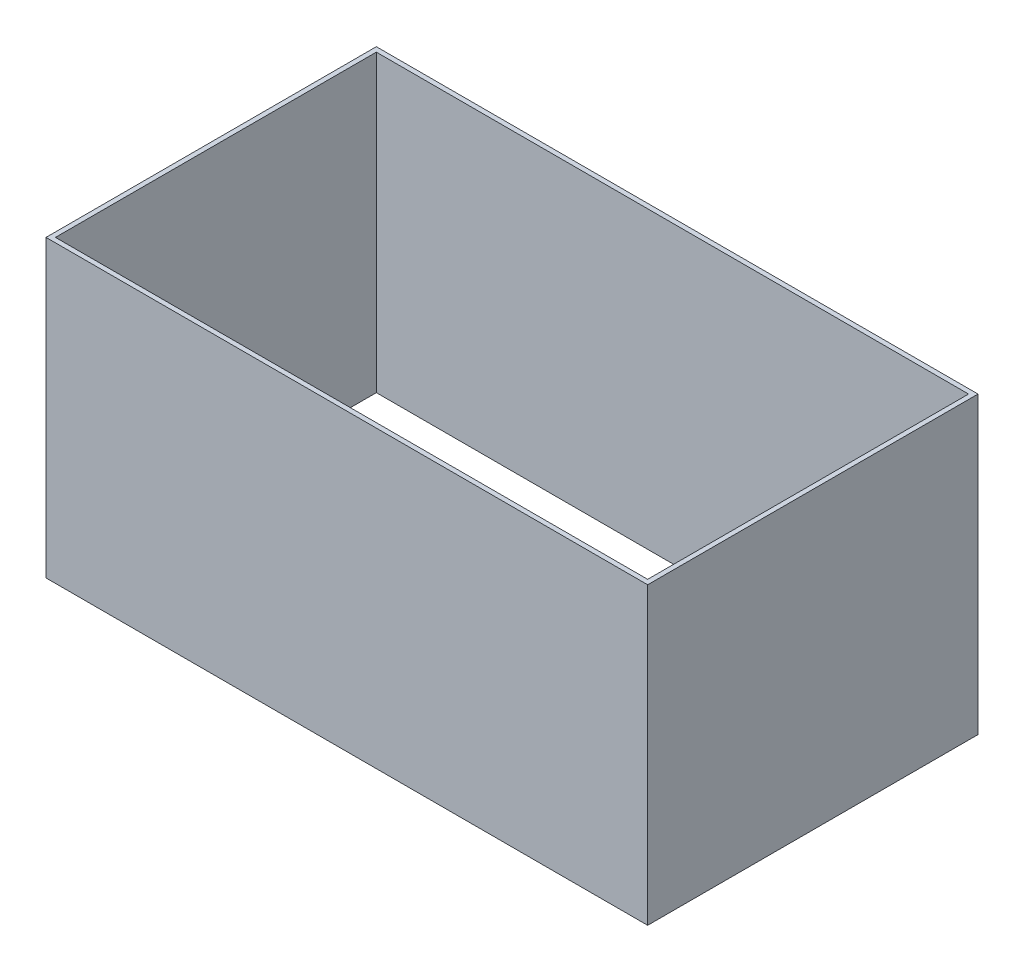
ISO-10303-21;
HEADER;
FILE_DESCRIPTION(('STEP AP214'),'2;1');
FILE_NAME('part.step','',(''),(''),'','','');
FILE_SCHEMA(('AUTOMOTIVE_DESIGN { 1 0 10303 214 1 1 1 1 }'));
ENDSEC;
DATA;
#1=APPLICATION_CONTEXT('core data for automotive mechanical design processes');
#2=APPLICATION_PROTOCOL_DEFINITION('international standard','automotive_design',2000,#1);
#3=PRODUCT_CONTEXT('',#1,'mechanical');
#4=PRODUCT('Part','Part','',(#3));
#5=PRODUCT_RELATED_PRODUCT_CATEGORY('part','',(#4));
#6=PRODUCT_DEFINITION_FORMATION('','',#4);
#7=PRODUCT_DEFINITION_CONTEXT('part definition',#1,'design');
#8=PRODUCT_DEFINITION('design','',#6,#7);
#9=PRODUCT_DEFINITION_SHAPE('','',#8);
#10=(LENGTH_UNIT() NAMED_UNIT(*) SI_UNIT(.MILLI.,.METRE.));
#11=(NAMED_UNIT(*) PLANE_ANGLE_UNIT() SI_UNIT($,.RADIAN.));
#12=(NAMED_UNIT(*) SI_UNIT($,.STERADIAN.) SOLID_ANGLE_UNIT());
#13=UNCERTAINTY_MEASURE_WITH_UNIT(LENGTH_MEASURE(1.E-05),#10,'distance_accuracy_value','');
#14=(GEOMETRIC_REPRESENTATION_CONTEXT(3) GLOBAL_UNCERTAINTY_ASSIGNED_CONTEXT((#13)) GLOBAL_UNIT_ASSIGNED_CONTEXT((#10,
#11,#12)) REPRESENTATION_CONTEXT('',''));
#15=CARTESIAN_POINT('',(0.,0.,0.));
#16=DIRECTION('',(0.,0.,1.));
#17=DIRECTION('',(1.,0.,0.));
#18=AXIS2_PLACEMENT_3D('',#15,#16,#17);
#19=CARTESIAN_POINT('',(0.,50.,0.));
#20=DIRECTION('',(0.,1.,0.));
#21=DIRECTION('',(0.,0.,1.));
#22=AXIS2_PLACEMENT_3D('',#19,#20,#21);
#23=PLANE('',#22);
#24=DIRECTION('',(0.,0.,-1.));
#25=VECTOR('',#24,1.);
#26=CARTESIAN_POINT('',(51.,50.,-28.));
#27=LINE('',#26,#25);
#28=CARTESIAN_POINT('',(51.,50.,28.));
#29=VERTEX_POINT('',#28);
#30=CARTESIAN_POINT('',(51.,50.,-28.));
#31=VERTEX_POINT('',#30);
#32=EDGE_CURVE('E187',#29,#31,#27,.T.);
#33=ORIENTED_EDGE('',*,*,#32,.T.);
#34=DIRECTION('',(-1.,0.,0.));
#35=VECTOR('',#34,1.);
#36=CARTESIAN_POINT('',(-51.,50.,-28.));
#37=LINE('',#36,#35);
#38=CARTESIAN_POINT('',(-51.,50.,-28.));
#39=VERTEX_POINT('',#38);
#40=EDGE_CURVE('E190',#31,#39,#37,.T.);
#41=ORIENTED_EDGE('',*,*,#40,.T.);
#42=DIRECTION('',(0.,0.,1.));
#43=VECTOR('',#42,1.);
#44=CARTESIAN_POINT('',(-51.,50.,-28.));
#45=LINE('',#44,#43);
#46=CARTESIAN_POINT('',(-51.,50.,28.));
#47=VERTEX_POINT('',#46);
#48=EDGE_CURVE('E193',#39,#47,#45,.T.);
#49=ORIENTED_EDGE('',*,*,#48,.T.);
#50=DIRECTION('',(1.,0.,0.));
#51=VECTOR('',#50,1.);
#52=CARTESIAN_POINT('',(-51.,50.,28.));
#53=LINE('',#52,#51);
#54=EDGE_CURVE('E195',#47,#29,#53,.T.);
#55=ORIENTED_EDGE('',*,*,#54,.T.);
#56=EDGE_LOOP('',(#33,#41,#49,#55));
#57=FACE_BOUND('',#56,.T.);
#58=DIRECTION('',(-1.,0.,0.));
#59=VECTOR('',#58,1.);
#60=CARTESIAN_POINT('',(-50.2,50.,-27.2));
#61=LINE('',#60,#59);
#62=CARTESIAN_POINT('',(50.2,50.,-27.2));
#63=VERTEX_POINT('',#62);
#64=CARTESIAN_POINT('',(-50.2,50.,-27.2));
#65=VERTEX_POINT('',#64);
#66=EDGE_CURVE('E160',#63,#65,#61,.T.);
#67=ORIENTED_EDGE('',*,*,#66,.F.);
#68=DIRECTION('',(0.,0.,-1.));
#69=VECTOR('',#68,1.);
#70=CARTESIAN_POINT('',(50.2,50.,27.2));
#71=LINE('',#70,#69);
#72=CARTESIAN_POINT('',(50.2,50.,27.2));
#73=VERTEX_POINT('',#72);
#74=EDGE_CURVE('E158',#73,#63,#71,.T.);
#75=ORIENTED_EDGE('',*,*,#74,.F.);
#76=DIRECTION('',(1.,0.,0.));
#77=VECTOR('',#76,1.);
#78=CARTESIAN_POINT('',(-50.2,50.,27.2));
#79=LINE('',#78,#77);
#80=CARTESIAN_POINT('',(-50.2,50.,27.2));
#81=VERTEX_POINT('',#80);
#82=EDGE_CURVE('E165',#81,#73,#79,.T.);
#83=ORIENTED_EDGE('',*,*,#82,.F.);
#84=DIRECTION('',(0.,0.,1.));
#85=VECTOR('',#84,1.);
#86=CARTESIAN_POINT('',(-50.2,50.,27.2));
#87=LINE('',#86,#85);
#88=EDGE_CURVE('E163',#65,#81,#87,.T.);
#89=ORIENTED_EDGE('',*,*,#88,.F.);
#90=EDGE_LOOP('',(#67,#75,#83,#89));
#91=FACE_BOUND('',#90,.T.);
#92=ADVANCED_FACE('F33',(#57,#91),#23,.T.);
#93=CARTESIAN_POINT('',(0.,0.,0.));
#94=DIRECTION('',(0.,1.,0.));
#95=DIRECTION('',(0.,0.,1.));
#96=AXIS2_PLACEMENT_3D('',#93,#94,#95);
#97=PLANE('',#96);
#98=DIRECTION('',(0.,0.,1.));
#99=VECTOR('',#98,1.);
#100=CARTESIAN_POINT('',(-51.,0.,-28.));
#101=LINE('',#100,#99);
#102=CARTESIAN_POINT('',(-51.,0.,-7.));
#103=VERTEX_POINT('',#102);
#104=CARTESIAN_POINT('',(-51.,0.,28.));
#105=VERTEX_POINT('',#104);
#106=EDGE_CURVE('E202',#103,#105,#101,.T.);
#107=ORIENTED_EDGE('',*,*,#106,.F.);
#108=DIRECTION('',(-1.,0.,0.));
#109=VECTOR('',#108,1.);
#110=CARTESIAN_POINT('',(51.001,0.,-7.));
#111=LINE('',#110,#109);
#112=CARTESIAN_POINT('',(-50.2,0.,-7.));
#113=VERTEX_POINT('',#112);
#114=EDGE_CURVE('E141',#113,#103,#111,.T.);
#115=ORIENTED_EDGE('',*,*,#114,.F.);
#116=DIRECTION('',(0.,0.,1.));
#117=VECTOR('',#116,1.);
#118=CARTESIAN_POINT('',(-50.2,0.,27.2));
#119=LINE('',#118,#117);
#120=CARTESIAN_POINT('',(-50.2,0.,27.2));
#121=VERTEX_POINT('',#120);
#122=EDGE_CURVE('E145',#113,#121,#119,.T.);
#123=ORIENTED_EDGE('',*,*,#122,.T.);
#124=DIRECTION('',(1.,0.,0.));
#125=VECTOR('',#124,1.);
#126=CARTESIAN_POINT('',(-50.2,0.,27.2));
#127=LINE('',#126,#125);
#128=CARTESIAN_POINT('',(50.2,0.,27.2));
#129=VERTEX_POINT('',#128);
#130=EDGE_CURVE('E161',#121,#129,#127,.T.);
#131=ORIENTED_EDGE('',*,*,#130,.T.);
#132=DIRECTION('',(0.,0.,-1.));
#133=VECTOR('',#132,1.);
#134=CARTESIAN_POINT('',(50.2,0.,27.2));
#135=LINE('',#134,#133);
#136=CARTESIAN_POINT('',(50.2,0.,-27.2));
#137=VERTEX_POINT('',#136);
#138=EDGE_CURVE('E154',#129,#137,#135,.T.);
#139=ORIENTED_EDGE('',*,*,#138,.T.);
#140=DIRECTION('',(-1.,0.,0.));
#141=VECTOR('',#140,1.);
#142=CARTESIAN_POINT('',(-50.2,0.,-27.2));
#143=LINE('',#142,#141);
#144=CARTESIAN_POINT('',(-50.2,0.,-27.2));
#145=VERTEX_POINT('',#144);
#146=EDGE_CURVE('E170',#137,#145,#143,.T.);
#147=ORIENTED_EDGE('',*,*,#146,.T.);
#148=CARTESIAN_POINT('',(-50.2,0.,-15.));
#149=VERTEX_POINT('',#148);
#150=EDGE_CURVE('E173',#145,#149,#119,.T.);
#151=ORIENTED_EDGE('',*,*,#150,.T.);
#152=DIRECTION('',(-1.,0.,0.));
#153=VECTOR('',#152,1.);
#154=CARTESIAN_POINT('',(51.001,0.,-15.));
#155=LINE('',#154,#153);
#156=CARTESIAN_POINT('',(-51.,0.,-15.));
#157=VERTEX_POINT('',#156);
#158=EDGE_CURVE('E48',#149,#157,#155,.T.);
#159=ORIENTED_EDGE('',*,*,#158,.T.);
#160=CARTESIAN_POINT('',(-51.,0.,-28.));
#161=VERTEX_POINT('',#160);
#162=EDGE_CURVE('E203',#161,#157,#101,.T.);
#163=ORIENTED_EDGE('',*,*,#162,.F.);
#164=DIRECTION('',(-1.,0.,0.));
#165=VECTOR('',#164,1.);
#166=CARTESIAN_POINT('',(-51.,0.,-28.));
#167=LINE('',#166,#165);
#168=CARTESIAN_POINT('',(51.,0.,-28.));
#169=VERTEX_POINT('',#168);
#170=EDGE_CURVE('E200',#169,#161,#167,.T.);
#171=ORIENTED_EDGE('',*,*,#170,.F.);
#172=DIRECTION('',(0.,0.,-1.));
#173=VECTOR('',#172,1.);
#174=CARTESIAN_POINT('',(51.,0.,-28.));
#175=LINE('',#174,#173);
#176=CARTESIAN_POINT('',(51.,0.,28.));
#177=VERTEX_POINT('',#176);
#178=EDGE_CURVE('E186',#177,#169,#175,.T.);
#179=ORIENTED_EDGE('',*,*,#178,.F.);
#180=DIRECTION('',(1.,0.,0.));
#181=VECTOR('',#180,1.);
#182=CARTESIAN_POINT('',(-51.,0.,28.));
#183=LINE('',#182,#181);
#184=EDGE_CURVE('E191',#105,#177,#183,.T.);
#185=ORIENTED_EDGE('',*,*,#184,.F.);
#186=EDGE_LOOP('',(#107,#115,#123,#131,#139,#147,#151,#159,#163,#171,#179,#185));
#187=FACE_BOUND('',#186,.T.);
#188=ADVANCED_FACE('F222',(#187),#97,.F.);
#189=CARTESIAN_POINT('',(51.,50.,-28.));
#190=DIRECTION('',(-1.,0.,0.));
#191=DIRECTION('',(0.,0.,1.));
#192=AXIS2_PLACEMENT_3D('',#189,#190,#191);
#193=PLANE('',#192);
#194=ORIENTED_EDGE('',*,*,#178,.T.);
#195=DIRECTION('',(0.,-1.,0.));
#196=VECTOR('',#195,1.);
#197=CARTESIAN_POINT('',(51.,50.,-28.));
#198=LINE('',#197,#196);
#199=EDGE_CURVE('E11',#31,#169,#198,.T.);
#200=ORIENTED_EDGE('',*,*,#199,.F.);
#201=ORIENTED_EDGE('',*,*,#32,.F.);
#202=DIRECTION('',(0.,-1.,0.));
#203=VECTOR('',#202,1.);
#204=CARTESIAN_POINT('',(51.,50.,28.));
#205=LINE('',#204,#203);
#206=EDGE_CURVE('E197',#29,#177,#205,.T.);
#207=ORIENTED_EDGE('',*,*,#206,.T.);
#208=EDGE_LOOP('',(#194,#200,#201,#207));
#209=FACE_BOUND('',#208,.T.);
#210=ADVANCED_FACE('F35',(#209),#193,.F.);
#211=CARTESIAN_POINT('',(-51.,50.,-28.));
#212=DIRECTION('',(0.,0.,1.));
#213=DIRECTION('',(1.,0.,0.));
#214=AXIS2_PLACEMENT_3D('',#211,#212,#213);
#215=PLANE('',#214);
#216=ORIENTED_EDGE('',*,*,#170,.T.);
#217=DIRECTION('',(0.,-1.,0.));
#218=VECTOR('',#217,1.);
#219=CARTESIAN_POINT('',(-51.,50.,-28.));
#220=LINE('',#219,#218);
#221=EDGE_CURVE('E41',#39,#161,#220,.T.);
#222=ORIENTED_EDGE('',*,*,#221,.F.);
#223=ORIENTED_EDGE('',*,*,#40,.F.);
#224=ORIENTED_EDGE('',*,*,#199,.T.);
#225=EDGE_LOOP('',(#216,#222,#223,#224));
#226=FACE_BOUND('',#225,.T.);
#227=ADVANCED_FACE('F238',(#226),#215,.F.);
#228=CARTESIAN_POINT('',(-51.,50.,-28.));
#229=DIRECTION('',(1.,0.,0.));
#230=DIRECTION('',(0.,0.,-1.));
#231=AXIS2_PLACEMENT_3D('',#228,#229,#230);
#232=PLANE('',#231);
#233=DIRECTION('',(0.,0.,-1.));
#234=VECTOR('',#233,1.);
#235=CARTESIAN_POINT('',(-51.,6.,-15.));
#236=LINE('',#235,#234);
#237=CARTESIAN_POINT('',(-51.,6.,-7.));
#238=VERTEX_POINT('',#237);
#239=CARTESIAN_POINT('',(-51.,6.,-15.));
#240=VERTEX_POINT('',#239);
#241=EDGE_CURVE('E152',#238,#240,#236,.T.);
#242=ORIENTED_EDGE('',*,*,#241,.F.);
#243=DIRECTION('',(0.,1.,0.));
#244=VECTOR('',#243,1.);
#245=CARTESIAN_POINT('',(-51.,6.,-7.));
#246=LINE('',#245,#244);
#247=EDGE_CURVE('E139',#103,#238,#246,.T.);
#248=ORIENTED_EDGE('',*,*,#247,.F.);
#249=ORIENTED_EDGE('',*,*,#106,.T.);
#250=DIRECTION('',(0.,-1.,0.));
#251=VECTOR('',#250,1.);
#252=CARTESIAN_POINT('',(-51.,50.,28.));
#253=LINE('',#252,#251);
#254=EDGE_CURVE('E209',#47,#105,#253,.T.);
#255=ORIENTED_EDGE('',*,*,#254,.F.);
#256=ORIENTED_EDGE('',*,*,#48,.F.);
#257=ORIENTED_EDGE('',*,*,#221,.T.);
#258=ORIENTED_EDGE('',*,*,#162,.T.);
#259=DIRECTION('',(0.,-1.,0.));
#260=VECTOR('',#259,1.);
#261=CARTESIAN_POINT('',(-51.,6.,-15.));
#262=LINE('',#261,#260);
#263=EDGE_CURVE('E149',#240,#157,#262,.T.);
#264=ORIENTED_EDGE('',*,*,#263,.F.);
#265=EDGE_LOOP('',(#242,#248,#249,#255,#256,#257,#258,#264));
#266=FACE_BOUND('',#265,.T.);
#267=ADVANCED_FACE('F216',(#266),#232,.F.);
#268=CARTESIAN_POINT('',(-51.,50.,28.));
#269=DIRECTION('',(0.,0.,-1.));
#270=DIRECTION('',(-1.,0.,0.));
#271=AXIS2_PLACEMENT_3D('',#268,#269,#270);
#272=PLANE('',#271);
#273=ORIENTED_EDGE('',*,*,#184,.T.);
#274=ORIENTED_EDGE('',*,*,#206,.F.);
#275=ORIENTED_EDGE('',*,*,#54,.F.);
#276=ORIENTED_EDGE('',*,*,#254,.T.);
#277=EDGE_LOOP('',(#273,#274,#275,#276));
#278=FACE_BOUND('',#277,.T.);
#279=ADVANCED_FACE('F231',(#278),#272,.F.);
#280=CARTESIAN_POINT('',(50.2,50.,27.2));
#281=DIRECTION('',(-1.,0.,0.));
#282=DIRECTION('',(0.,0.,1.));
#283=AXIS2_PLACEMENT_3D('',#280,#281,#282);
#284=PLANE('',#283);
#285=ORIENTED_EDGE('',*,*,#138,.F.);
#286=DIRECTION('',(0.,-1.,0.));
#287=VECTOR('',#286,1.);
#288=CARTESIAN_POINT('',(50.2,50.,27.2));
#289=LINE('',#288,#287);
#290=EDGE_CURVE('E167',#73,#129,#289,.T.);
#291=ORIENTED_EDGE('',*,*,#290,.F.);
#292=ORIENTED_EDGE('',*,*,#74,.T.);
#293=DIRECTION('',(0.,-1.,0.));
#294=VECTOR('',#293,1.);
#295=CARTESIAN_POINT('',(50.2,50.,-27.2));
#296=LINE('',#295,#294);
#297=EDGE_CURVE('E183',#63,#137,#296,.T.);
#298=ORIENTED_EDGE('',*,*,#297,.T.);
#299=EDGE_LOOP('',(#285,#291,#292,#298));
#300=FACE_BOUND('',#299,.T.);
#301=ADVANCED_FACE('F252',(#300),#284,.T.);
#302=CARTESIAN_POINT('',(-50.2,50.,-27.2));
#303=DIRECTION('',(0.,0.,1.));
#304=DIRECTION('',(1.,0.,0.));
#305=AXIS2_PLACEMENT_3D('',#302,#303,#304);
#306=PLANE('',#305);
#307=ORIENTED_EDGE('',*,*,#146,.F.);
#308=ORIENTED_EDGE('',*,*,#297,.F.);
#309=ORIENTED_EDGE('',*,*,#66,.T.);
#310=DIRECTION('',(0.,-1.,0.));
#311=VECTOR('',#310,1.);
#312=CARTESIAN_POINT('',(-50.2,50.,-27.2));
#313=LINE('',#312,#311);
#314=EDGE_CURVE('E181',#65,#145,#313,.T.);
#315=ORIENTED_EDGE('',*,*,#314,.T.);
#316=EDGE_LOOP('',(#307,#308,#309,#315));
#317=FACE_BOUND('',#316,.T.);
#318=ADVANCED_FACE('F259',(#317),#306,.T.);
#319=CARTESIAN_POINT('',(-50.2,50.,27.2));
#320=DIRECTION('',(1.,0.,0.));
#321=DIRECTION('',(0.,0.,-1.));
#322=AXIS2_PLACEMENT_3D('',#319,#320,#321);
#323=PLANE('',#322);
#324=DIRECTION('',(0.,1.,0.));
#325=VECTOR('',#324,1.);
#326=CARTESIAN_POINT('',(-50.2,6.,-7.));
#327=LINE('',#326,#325);
#328=CARTESIAN_POINT('',(-50.2,6.,-7.));
#329=VERTEX_POINT('',#328);
#330=EDGE_CURVE('E133',#113,#329,#327,.T.);
#331=ORIENTED_EDGE('',*,*,#330,.T.);
#332=DIRECTION('',(0.,0.,-1.));
#333=VECTOR('',#332,1.);
#334=CARTESIAN_POINT('',(-50.2,6.,-15.));
#335=LINE('',#334,#333);
#336=CARTESIAN_POINT('',(-50.2,6.,-15.));
#337=VERTEX_POINT('',#336);
#338=EDGE_CURVE('E123',#329,#337,#335,.T.);
#339=ORIENTED_EDGE('',*,*,#338,.T.);
#340=DIRECTION('',(0.,-1.,0.));
#341=VECTOR('',#340,1.);
#342=CARTESIAN_POINT('',(-50.2,6.,-15.));
#343=LINE('',#342,#341);
#344=EDGE_CURVE('E132',#337,#149,#343,.T.);
#345=ORIENTED_EDGE('',*,*,#344,.T.);
#346=ORIENTED_EDGE('',*,*,#150,.F.);
#347=ORIENTED_EDGE('',*,*,#314,.F.);
#348=ORIENTED_EDGE('',*,*,#88,.T.);
#349=DIRECTION('',(0.,-1.,0.));
#350=VECTOR('',#349,1.);
#351=CARTESIAN_POINT('',(-50.2,50.,27.2));
#352=LINE('',#351,#350);
#353=EDGE_CURVE('E56',#81,#121,#352,.T.);
#354=ORIENTED_EDGE('',*,*,#353,.T.);
#355=ORIENTED_EDGE('',*,*,#122,.F.);
#356=EDGE_LOOP('',(#331,#339,#345,#346,#347,#348,#354,#355));
#357=FACE_BOUND('',#356,.T.);
#358=ADVANCED_FACE('F144',(#357),#323,.T.);
#359=CARTESIAN_POINT('',(-50.2,50.,27.2));
#360=DIRECTION('',(0.,0.,-1.));
#361=DIRECTION('',(-1.,0.,0.));
#362=AXIS2_PLACEMENT_3D('',#359,#360,#361);
#363=PLANE('',#362);
#364=ORIENTED_EDGE('',*,*,#130,.F.);
#365=ORIENTED_EDGE('',*,*,#353,.F.);
#366=ORIENTED_EDGE('',*,*,#82,.T.);
#367=ORIENTED_EDGE('',*,*,#290,.T.);
#368=EDGE_LOOP('',(#364,#365,#366,#367));
#369=FACE_BOUND('',#368,.T.);
#370=ADVANCED_FACE('F268',(#369),#363,.T.);
#371=CARTESIAN_POINT('',(51.001,6.,-7.));
#372=DIRECTION('',(0.,0.,1.));
#373=DIRECTION('',(0.,-1.,0.));
#374=AXIS2_PLACEMENT_3D('',#371,#372,#373);
#375=PLANE('',#374);
#376=ORIENTED_EDGE('',*,*,#114,.T.);
#377=ORIENTED_EDGE('',*,*,#247,.T.);
#378=DIRECTION('',(-1.,0.,0.));
#379=VECTOR('',#378,1.);
#380=CARTESIAN_POINT('',(51.001,6.,-7.));
#381=LINE('',#380,#379);
#382=EDGE_CURVE('E127',#329,#238,#381,.T.);
#383=ORIENTED_EDGE('',*,*,#382,.F.);
#384=ORIENTED_EDGE('',*,*,#330,.F.);
#385=EDGE_LOOP('',(#376,#377,#383,#384));
#386=FACE_BOUND('',#385,.T.);
#387=ADVANCED_FACE('F136',(#386),#375,.F.);
#388=CARTESIAN_POINT('',(51.001,6.,-15.));
#389=DIRECTION('',(0.,1.,0.));
#390=DIRECTION('',(0.,0.,1.));
#391=AXIS2_PLACEMENT_3D('',#388,#389,#390);
#392=PLANE('',#391);
#393=ORIENTED_EDGE('',*,*,#382,.T.);
#394=ORIENTED_EDGE('',*,*,#241,.T.);
#395=DIRECTION('',(-1.,0.,0.));
#396=VECTOR('',#395,1.);
#397=CARTESIAN_POINT('',(51.001,6.,-15.));
#398=LINE('',#397,#396);
#399=EDGE_CURVE('E129',#337,#240,#398,.T.);
#400=ORIENTED_EDGE('',*,*,#399,.F.);
#401=ORIENTED_EDGE('',*,*,#338,.F.);
#402=EDGE_LOOP('',(#393,#394,#400,#401));
#403=FACE_BOUND('',#402,.T.);
#404=ADVANCED_FACE('F125',(#403),#392,.F.);
#405=CARTESIAN_POINT('',(51.001,6.,-15.));
#406=DIRECTION('',(0.,0.,-1.));
#407=DIRECTION('',(-1.,0.,0.));
#408=AXIS2_PLACEMENT_3D('',#405,#406,#407);
#409=PLANE('',#408);
#410=ORIENTED_EDGE('',*,*,#399,.T.);
#411=ORIENTED_EDGE('',*,*,#263,.T.);
#412=ORIENTED_EDGE('',*,*,#158,.F.);
#413=ORIENTED_EDGE('',*,*,#344,.F.);
#414=EDGE_LOOP('',(#410,#411,#412,#413));
#415=FACE_BOUND('',#414,.T.);
#416=ADVANCED_FACE('F227',(#415),#409,.F.);
#417=CLOSED_SHELL('',(#92,#188,#210,#227,#267,#279,#301,#318,#358,#370,#387,#404,#416));
#418=MANIFOLD_SOLID_BREP('B2',#417);
#419=ADVANCED_BREP_SHAPE_REPRESENTATION('',(#18,#418),#14);
#420=SHAPE_DEFINITION_REPRESENTATION(#9,#419);
ENDSEC;
END-ISO-10303-21;
